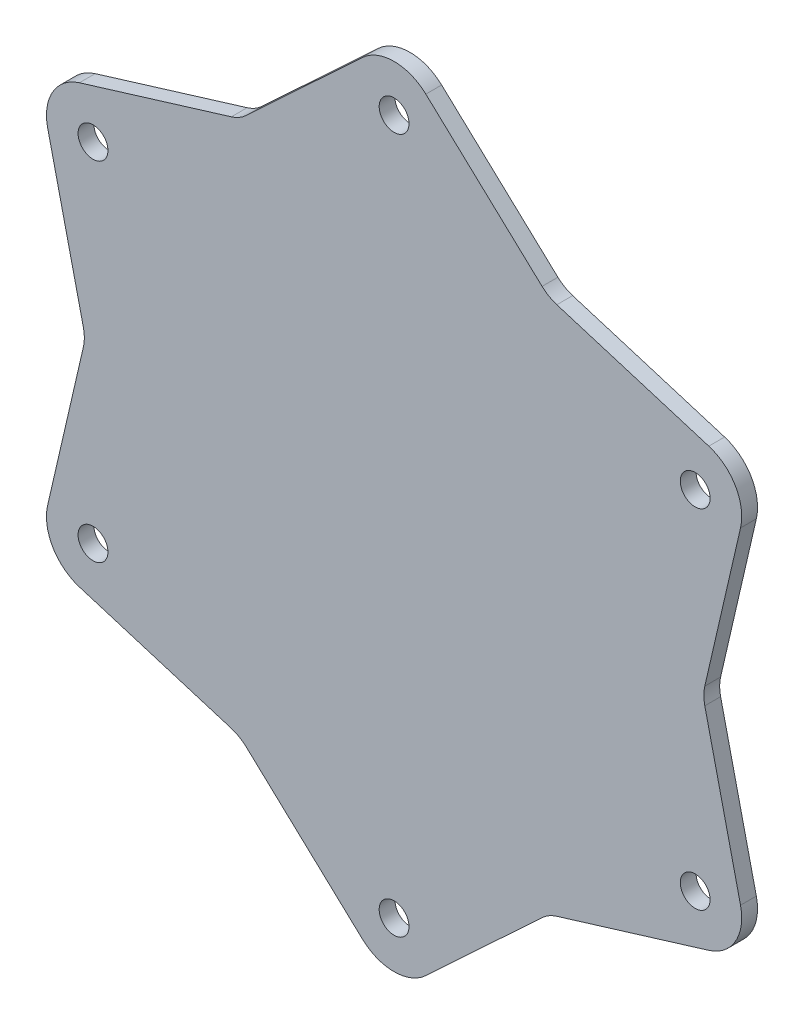
ISO-10303-21;
HEADER;
FILE_DESCRIPTION(('STEP AP214'),'2;1');
FILE_NAME('part.step','',(''),(''),'','','');
FILE_SCHEMA(('AUTOMOTIVE_DESIGN { 1 0 10303 214 1 1 1 1 }'));
ENDSEC;
DATA;
#1=APPLICATION_CONTEXT('core data for automotive mechanical design processes');
#2=APPLICATION_PROTOCOL_DEFINITION('international standard','automotive_design',2000,#1);
#3=PRODUCT_CONTEXT('',#1,'mechanical');
#4=PRODUCT('Part','Part','',(#3));
#5=PRODUCT_RELATED_PRODUCT_CATEGORY('part','',(#4));
#6=PRODUCT_DEFINITION_FORMATION('','',#4);
#7=PRODUCT_DEFINITION_CONTEXT('part definition',#1,'design');
#8=PRODUCT_DEFINITION('design','',#6,#7);
#9=PRODUCT_DEFINITION_SHAPE('','',#8);
#10=(LENGTH_UNIT() NAMED_UNIT(*) SI_UNIT(.MILLI.,.METRE.));
#11=(NAMED_UNIT(*) PLANE_ANGLE_UNIT() SI_UNIT($,.RADIAN.));
#12=(NAMED_UNIT(*) SI_UNIT($,.STERADIAN.) SOLID_ANGLE_UNIT());
#13=UNCERTAINTY_MEASURE_WITH_UNIT(LENGTH_MEASURE(1.E-05),#10,'distance_accuracy_value','');
#14=(GEOMETRIC_REPRESENTATION_CONTEXT(3) GLOBAL_UNCERTAINTY_ASSIGNED_CONTEXT((#13)) GLOBAL_UNIT_ASSIGNED_CONTEXT((#10,
#11,#12)) REPRESENTATION_CONTEXT('',''));
#15=CARTESIAN_POINT('',(0.,0.,0.));
#16=DIRECTION('',(0.,0.,1.));
#17=DIRECTION('',(1.,0.,0.));
#18=AXIS2_PLACEMENT_3D('',#15,#16,#17);
#19=CARTESIAN_POINT('',(0.,69.85,3.175));
#20=DIRECTION('',(0.,0.,1.));
#21=DIRECTION('',(1.,0.,0.));
#22=AXIS2_PLACEMENT_3D('',#19,#20,#21);
#23=PLANE('',#22);
#24=CARTESIAN_POINT('',(-60.4918744543433,-34.9249999999994,3.175));
#25=DIRECTION('',(0.,0.,1.));
#26=DIRECTION('',(1.,0.,0.));
#27=AXIS2_PLACEMENT_3D('',#24,#25,#26);
#28=CIRCLE('',#27,3.);
#29=CARTESIAN_POINT('',(-57.4918744543433,-34.9249999999994,3.175));
#30=VERTEX_POINT('',#29);
#31=EDGE_CURVE('E538',#30,#30,#28,.T.);
#32=ORIENTED_EDGE('',*,*,#31,.F.);
#33=EDGE_LOOP('',(#32));
#34=FACE_BOUND('',#33,.T.);
#35=CARTESIAN_POINT('',(60.4918744543429,-34.9250000000003,3.175));
#36=DIRECTION('',(0.,0.,1.));
#37=DIRECTION('',(1.,0.,0.));
#38=AXIS2_PLACEMENT_3D('',#35,#36,#37);
#39=CIRCLE('',#38,3.00000000000001);
#40=CARTESIAN_POINT('',(63.4918744543429,-34.9250000000003,3.175));
#41=VERTEX_POINT('',#40);
#42=EDGE_CURVE('E554',#41,#41,#39,.T.);
#43=ORIENTED_EDGE('',*,*,#42,.F.);
#44=EDGE_LOOP('',(#43));
#45=FACE_BOUND('',#44,.T.);
#46=CARTESIAN_POINT('',(0.,69.85,3.175));
#47=DIRECTION('',(0.,0.,1.));
#48=DIRECTION('',(1.,0.,0.));
#49=AXIS2_PLACEMENT_3D('',#46,#47,#48);
#50=CIRCLE('',#49,3.);
#51=CARTESIAN_POINT('',(3.,69.85,3.175));
#52=VERTEX_POINT('',#51);
#53=EDGE_CURVE('E248',#52,#52,#50,.T.);
#54=ORIENTED_EDGE('',*,*,#53,.F.);
#55=EDGE_LOOP('',(#54));
#56=FACE_BOUND('',#55,.T.);
#57=CARTESIAN_POINT('',(0.,69.85,3.175));
#58=DIRECTION('',(0.,0.,1.));
#59=DIRECTION('',(1.,0.,0.));
#60=AXIS2_PLACEMENT_3D('',#57,#58,#59);
#61=CIRCLE('',#60,9.35);
#62=CARTESIAN_POINT('',(6.37567942182381,76.6890943779226,3.175));
#63=VERTEX_POINT('',#62);
#64=CARTESIAN_POINT('',(-6.37567942182381,76.6890943779226,3.175));
#65=VERTEX_POINT('',#64);
#66=EDGE_CURVE('E314',#63,#65,#61,.T.);
#67=ORIENTED_EDGE('',*,*,#66,.T.);
#68=DIRECTION('',(-0.731453944162845,-0.681890847253883,0.));
#69=VECTOR('',#68,1.);
#70=CARTESIAN_POINT('',(-6.37567942182381,76.6890943779226,3.175));
#71=LINE('',#70,#69);
#72=CARTESIAN_POINT('',(-29.7289917439253,54.918195399822,3.175));
#73=VERTEX_POINT('',#72);
#74=EDGE_CURVE('E154',#65,#73,#71,.T.);
#75=ORIENTED_EDGE('',*,*,#74,.T.);
#76=CARTESIAN_POINT('',(-34.9249999999992,60.4918744543435,3.175));
#77=DIRECTION('',(0.,0.,-1.));
#78=DIRECTION('',(1.,0.,0.));
#79=AXIS2_PLACEMENT_3D('',#76,#77,#78);
#80=CIRCLE('',#79,7.62);
#81=CARTESIAN_POINT('',(-32.6960564742811,53.2051597790483,3.175));
#82=VERTEX_POINT('',#81);
#83=EDGE_CURVE('E399',#73,#82,#80,.T.);
#84=ORIENTED_EDGE('',*,*,#83,.T.);
#85=DIRECTION('',(-0.956261768411379,-0.292512273716407,0.));
#86=VECTOR('',#85,1.);
#87=CARTESIAN_POINT('',(-63.2268642135916,43.8660475346463,3.175));
#88=LINE('',#87,#86);
#89=CARTESIAN_POINT('',(-63.2268642135918,43.8660475346469,3.175));
#90=VERTEX_POINT('',#89);
#91=EDGE_CURVE('E419',#82,#90,#88,.T.);
#92=ORIENTED_EDGE('',*,*,#91,.T.);
#93=CARTESIAN_POINT('',(-60.4918744543426,34.9250000000007,3.175));
#94=DIRECTION('',(0.,0.,1.));
#95=DIRECTION('',(1.,0.,0.));
#96=AXIS2_PLACEMENT_3D('',#93,#94,#95);
#97=CIRCLE('',#96,9.35000000000005);
#98=CARTESIAN_POINT('',(-69.6025436354154,32.8230468432761,3.175));
#99=VERTEX_POINT('',#98);
#100=EDGE_CURVE('E415',#90,#99,#97,.T.);
#101=ORIENTED_EDGE('',*,*,#100,.T.);
#102=DIRECTION('',(0.224807824248535,-0.974403120970289,0.));
#103=VECTOR('',#102,1.);
#104=CARTESIAN_POINT('',(-69.6025436354154,32.8230468432761,3.175));
#105=LINE('',#104,#103);
#106=CARTESIAN_POINT('',(-62.4250482182063,1.71303562077369,3.175));
#107=VERTEX_POINT('',#106);
#108=EDGE_CURVE('E418',#99,#107,#105,.T.);
#109=ORIENTED_EDGE('',*,*,#108,.T.);
#110=CARTESIAN_POINT('',(-69.85,7.32053306862213E-13,3.175));
#111=DIRECTION('',(0.,0.,-1.));
#112=DIRECTION('',(1.,0.,0.));
#113=AXIS2_PLACEMENT_3D('',#110,#111,#112);
#114=CIRCLE('',#113,7.61999999999985);
#115=CARTESIAN_POINT('',(-62.4250482182065,-1.71303562077395,3.175));
#116=VERTEX_POINT('',#115);
#117=EDGE_CURVE('E423',#107,#116,#114,.T.);
#118=ORIENTED_EDGE('',*,*,#117,.T.);
#119=DIRECTION('',(-0.224807824248533,-0.97440312097029,0.));
#120=VECTOR('',#119,1.);
#121=CARTESIAN_POINT('',(-69.6025436354153,-32.8230468432764,3.175));
#122=LINE('',#121,#120);
#123=CARTESIAN_POINT('',(-69.6025436354158,-32.8230468432763,3.175));
#124=VERTEX_POINT('',#123);
#125=EDGE_CURVE('E430',#116,#124,#122,.T.);
#126=ORIENTED_EDGE('',*,*,#125,.T.);
#127=CARTESIAN_POINT('',(-60.4918744543433,-34.9249999999994,3.175));
#128=DIRECTION('',(0.,0.,1.));
#129=DIRECTION('',(1.,0.,0.));
#130=AXIS2_PLACEMENT_3D('',#127,#128,#129);
#131=CIRCLE('',#130,9.35000000000015);
#132=CARTESIAN_POINT('',(-63.2268642135915,-43.8660475346466,3.175));
#133=VERTEX_POINT('',#132);
#134=EDGE_CURVE('E433',#124,#133,#131,.T.);
#135=ORIENTED_EDGE('',*,*,#134,.T.);
#136=DIRECTION('',(0.956261768411379,-0.292512273716406,0.));
#137=VECTOR('',#136,1.);
#138=CARTESIAN_POINT('',(-63.2268642135915,-43.8660475346466,3.175));
#139=LINE('',#138,#137);
#140=CARTESIAN_POINT('',(-32.696056474281,-53.2051597790484,3.175));
#141=VERTEX_POINT('',#140);
#142=EDGE_CURVE('E436',#133,#141,#139,.T.);
#143=ORIENTED_EDGE('',*,*,#142,.T.);
#144=CARTESIAN_POINT('',(-34.9250000000005,-60.4918744543427,3.175));
#145=DIRECTION('',(0.,0.,-1.));
#146=DIRECTION('',(1.,0.,0.));
#147=AXIS2_PLACEMENT_3D('',#144,#145,#146);
#148=CIRCLE('',#147,7.61999999999978);
#149=CARTESIAN_POINT('',(-29.7289917439255,-54.9181953998224,3.175));
#150=VERTEX_POINT('',#149);
#151=EDGE_CURVE('E439',#141,#150,#148,.T.);
#152=ORIENTED_EDGE('',*,*,#151,.T.);
#153=DIRECTION('',(0.731453944162845,-0.681890847253882,0.));
#154=VECTOR('',#153,1.);
#155=CARTESIAN_POINT('',(-6.37567942182381,-76.6890943779228,3.175));
#156=LINE('',#155,#154);
#157=CARTESIAN_POINT('',(-6.37567942182404,-76.6890943779231,3.175));
#158=VERTEX_POINT('',#157);
#159=EDGE_CURVE('E442',#150,#158,#156,.T.);
#160=ORIENTED_EDGE('',*,*,#159,.T.);
#161=CARTESIAN_POINT('',(-4.94698836940293E-13,-69.85,3.175));
#162=DIRECTION('',(0.,0.,1.));
#163=DIRECTION('',(1.,0.,0.));
#164=AXIS2_PLACEMENT_3D('',#161,#162,#163);
#165=CIRCLE('',#164,9.35000000000018);
#166=CARTESIAN_POINT('',(6.3756794218238,-76.6890943779228,3.175));
#167=VERTEX_POINT('',#166);
#168=EDGE_CURVE('E445',#158,#167,#165,.T.);
#169=ORIENTED_EDGE('',*,*,#168,.T.);
#170=DIRECTION('',(0.731453944162845,0.681890847253883,0.));
#171=VECTOR('',#170,1.);
#172=CARTESIAN_POINT('',(6.3756794218238,-76.6890943779228,3.175));
#173=LINE('',#172,#171);
#174=CARTESIAN_POINT('',(29.7289917439254,-54.9181953998223,3.175));
#175=VERTEX_POINT('',#174);
#176=EDGE_CURVE('E448',#167,#175,#173,.T.);
#177=ORIENTED_EDGE('',*,*,#176,.T.);
#178=CARTESIAN_POINT('',(34.9249999999996,-60.4918744543433,3.175));
#179=DIRECTION('',(0.,0.,-1.));
#180=DIRECTION('',(1.,0.,0.));
#181=AXIS2_PLACEMENT_3D('',#178,#179,#180);
#182=CIRCLE('',#181,7.61999999999982);
#183=CARTESIAN_POINT('',(32.696056474281,-53.2051597790486,3.175));
#184=VERTEX_POINT('',#183);
#185=EDGE_CURVE('E451',#175,#184,#182,.T.);
#186=ORIENTED_EDGE('',*,*,#185,.T.);
#187=DIRECTION('',(0.956261768411379,0.292512273716407,0.));
#188=VECTOR('',#187,1.);
#189=CARTESIAN_POINT('',(63.2268642135915,-43.8660475346466,3.175));
#190=LINE('',#189,#188);
#191=CARTESIAN_POINT('',(63.2268642135916,-43.8660475346467,3.175));
#192=VERTEX_POINT('',#191);
#193=EDGE_CURVE('E454',#184,#192,#190,.T.);
#194=ORIENTED_EDGE('',*,*,#193,.T.);
#195=CARTESIAN_POINT('',(60.4918744543429,-34.9250000000003,3.175));
#196=DIRECTION('',(0.,0.,1.));
#197=DIRECTION('',(1.,0.,0.));
#198=AXIS2_PLACEMENT_3D('',#195,#196,#197);
#199=CIRCLE('',#198,9.35000000000012);
#200=CARTESIAN_POINT('',(69.6025436354153,-32.8230468432764,3.175));
#201=VERTEX_POINT('',#200);
#202=EDGE_CURVE('E457',#192,#201,#199,.T.);
#203=ORIENTED_EDGE('',*,*,#202,.T.);
#204=DIRECTION('',(-0.224807824248534,0.974403120970289,0.));
#205=VECTOR('',#204,1.);
#206=CARTESIAN_POINT('',(69.6025436354153,-32.8230468432764,3.175));
#207=LINE('',#206,#205);
#208=CARTESIAN_POINT('',(62.4250482182065,-1.71303562077391,3.175));
#209=VERTEX_POINT('',#208);
#210=EDGE_CURVE('E460',#201,#209,#207,.T.);
#211=ORIENTED_EDGE('',*,*,#210,.T.);
#212=CARTESIAN_POINT('',(69.85,-2.39391839684799E-13,3.175));
#213=DIRECTION('',(0.,0.,-1.));
#214=DIRECTION('',(1.,0.,0.));
#215=AXIS2_PLACEMENT_3D('',#212,#213,#214);
#216=CIRCLE('',#215,7.6199999999999);
#217=CARTESIAN_POINT('',(62.4250482182065,1.71303562077369,3.175));
#218=VERTEX_POINT('',#217);
#219=EDGE_CURVE('E463',#209,#218,#216,.T.);
#220=ORIENTED_EDGE('',*,*,#219,.T.);
#221=DIRECTION('',(0.224807824248534,0.974403120970289,0.));
#222=VECTOR('',#221,1.);
#223=CARTESIAN_POINT('',(69.6025436354153,32.8230468432761,3.175));
#224=LINE('',#223,#222);
#225=CARTESIAN_POINT('',(69.6025436354154,32.8230468432761,3.175));
#226=VERTEX_POINT('',#225);
#227=EDGE_CURVE('E466',#218,#226,#224,.T.);
#228=ORIENTED_EDGE('',*,*,#227,.T.);
#229=CARTESIAN_POINT('',(60.4918744543431,34.9249999999999,3.175));
#230=DIRECTION('',(0.,0.,1.));
#231=DIRECTION('',(1.,0.,0.));
#232=AXIS2_PLACEMENT_3D('',#229,#230,#231);
#233=CIRCLE('',#232,9.35000000000004);
#234=CARTESIAN_POINT('',(63.2268642135915,43.8660475346463,3.175));
#235=VERTEX_POINT('',#234);
#236=EDGE_CURVE('E221',#226,#235,#233,.T.);
#237=ORIENTED_EDGE('',*,*,#236,.T.);
#238=DIRECTION('',(-0.956261768411379,0.292512273716406,0.));
#239=VECTOR('',#238,1.);
#240=CARTESIAN_POINT('',(63.2268642135915,43.8660475346463,3.175));
#241=LINE('',#240,#239);
#242=CARTESIAN_POINT('',(32.696056474281,53.2051597790483,3.175));
#243=VERTEX_POINT('',#242);
#244=EDGE_CURVE('E215',#235,#243,#241,.T.);
#245=ORIENTED_EDGE('',*,*,#244,.T.);
#246=CARTESIAN_POINT('',(34.9250000000001,60.491874454343,3.175));
#247=DIRECTION('',(0.,0.,-1.));
#248=DIRECTION('',(1.,0.,0.));
#249=AXIS2_PLACEMENT_3D('',#246,#247,#248);
#250=CIRCLE('',#249,7.62);
#251=CARTESIAN_POINT('',(29.7289917439255,54.9181953998221,3.175));
#252=VERTEX_POINT('',#251);
#253=EDGE_CURVE('E219',#243,#252,#250,.T.);
#254=ORIENTED_EDGE('',*,*,#253,.T.);
#255=DIRECTION('',(-0.731453944162845,0.681890847253883,0.));
#256=VECTOR('',#255,1.);
#257=CARTESIAN_POINT('',(6.37567942182381,76.6890943779226,3.175));
#258=LINE('',#257,#256);
#259=EDGE_CURVE('E63',#252,#63,#258,.T.);
#260=ORIENTED_EDGE('',*,*,#259,.T.);
#261=EDGE_LOOP('',(#67,#75,#84,#92,#101,#109,#118,#126,#135,#143,#152,#160,#169,#177,#186,#194,
#203,#211,#220,#228,#237,#245,#254,#260));
#262=FACE_BOUND('',#261,.T.);
#263=CARTESIAN_POINT('',(60.4918744543431,34.9249999999999,3.175));
#264=DIRECTION('',(0.,0.,1.));
#265=DIRECTION('',(1.,0.,0.));
#266=AXIS2_PLACEMENT_3D('',#263,#264,#265);
#267=CIRCLE('',#266,3.);
#268=CARTESIAN_POINT('',(63.4918744543431,34.9249999999999,3.175));
#269=VERTEX_POINT('',#268);
#270=EDGE_CURVE('E562',#269,#269,#267,.T.);
#271=ORIENTED_EDGE('',*,*,#270,.F.);
#272=EDGE_LOOP('',(#271));
#273=FACE_BOUND('',#272,.T.);
#274=CARTESIAN_POINT('',(-4.94698836940293E-13,-69.85,3.175));
#275=DIRECTION('',(0.,0.,1.));
#276=DIRECTION('',(1.,0.,0.));
#277=AXIS2_PLACEMENT_3D('',#274,#275,#276);
#278=CIRCLE('',#277,3.);
#279=CARTESIAN_POINT('',(2.99999999999951,-69.85,3.175));
#280=VERTEX_POINT('',#279);
#281=EDGE_CURVE('E546',#280,#280,#278,.T.);
#282=ORIENTED_EDGE('',*,*,#281,.F.);
#283=EDGE_LOOP('',(#282));
#284=FACE_BOUND('',#283,.T.);
#285=CARTESIAN_POINT('',(-60.4918744543426,34.9250000000007,3.175));
#286=DIRECTION('',(0.,0.,1.));
#287=DIRECTION('',(1.,0.,0.));
#288=AXIS2_PLACEMENT_3D('',#285,#286,#287);
#289=CIRCLE('',#288,3.);
#290=CARTESIAN_POINT('',(-57.4918744543426,34.9250000000007,3.175));
#291=VERTEX_POINT('',#290);
#292=EDGE_CURVE('E527',#291,#291,#289,.T.);
#293=ORIENTED_EDGE('',*,*,#292,.F.);
#294=EDGE_LOOP('',(#293));
#295=FACE_BOUND('',#294,.T.);
#296=ADVANCED_FACE('F45',(#34,#45,#56,#262,#273,#284,#295),#23,.T.);
#297=CARTESIAN_POINT('',(0.,69.85,0.));
#298=DIRECTION('',(0.,0.,1.));
#299=DIRECTION('',(1.,0.,0.));
#300=AXIS2_PLACEMENT_3D('',#297,#298,#299);
#301=PLANE('',#300);
#302=CARTESIAN_POINT('',(0.,69.85,0.));
#303=DIRECTION('',(0.,0.,1.));
#304=DIRECTION('',(1.,0.,0.));
#305=AXIS2_PLACEMENT_3D('',#302,#303,#304);
#306=CIRCLE('',#305,9.35);
#307=CARTESIAN_POINT('',(6.37567942182381,76.6890943779226,0.));
#308=VERTEX_POINT('',#307);
#309=CARTESIAN_POINT('',(-6.37567942182381,76.6890943779226,0.));
#310=VERTEX_POINT('',#309);
#311=EDGE_CURVE('E243',#308,#310,#306,.T.);
#312=ORIENTED_EDGE('',*,*,#311,.F.);
#313=DIRECTION('',(-0.731453944162845,0.681890847253883,0.));
#314=VECTOR('',#313,1.);
#315=CARTESIAN_POINT('',(6.37567942182381,76.6890943779226,0.));
#316=LINE('',#315,#314);
#317=CARTESIAN_POINT('',(29.7289917439255,54.9181953998221,0.));
#318=VERTEX_POINT('',#317);
#319=EDGE_CURVE('E146',#318,#308,#316,.T.);
#320=ORIENTED_EDGE('',*,*,#319,.F.);
#321=CARTESIAN_POINT('',(34.9250000000001,60.491874454343,0.));
#322=DIRECTION('',(0.,0.,-1.));
#323=DIRECTION('',(1.,0.,0.));
#324=AXIS2_PLACEMENT_3D('',#321,#322,#323);
#325=CIRCLE('',#324,7.62);
#326=CARTESIAN_POINT('',(32.696056474281,53.2051597790483,0.));
#327=VERTEX_POINT('',#326);
#328=EDGE_CURVE('E140',#327,#318,#325,.T.);
#329=ORIENTED_EDGE('',*,*,#328,.F.);
#330=DIRECTION('',(-0.956261768411379,0.292512273716406,0.));
#331=VECTOR('',#330,1.);
#332=CARTESIAN_POINT('',(63.2268642135915,43.8660475346463,0.));
#333=LINE('',#332,#331);
#334=CARTESIAN_POINT('',(63.2268642135915,43.8660475346463,0.));
#335=VERTEX_POINT('',#334);
#336=EDGE_CURVE('E230',#335,#327,#333,.T.);
#337=ORIENTED_EDGE('',*,*,#336,.F.);
#338=CARTESIAN_POINT('',(60.4918744543431,34.9249999999999,0.));
#339=DIRECTION('',(0.,0.,1.));
#340=DIRECTION('',(1.,0.,0.));
#341=AXIS2_PLACEMENT_3D('',#338,#339,#340);
#342=CIRCLE('',#341,9.35000000000004);
#343=CARTESIAN_POINT('',(69.6025436354154,32.8230468432761,0.));
#344=VERTEX_POINT('',#343);
#345=EDGE_CURVE('E305',#344,#335,#342,.T.);
#346=ORIENTED_EDGE('',*,*,#345,.F.);
#347=DIRECTION('',(0.224807824248534,0.974403120970289,0.));
#348=VECTOR('',#347,1.);
#349=CARTESIAN_POINT('',(69.6025436354153,32.8230468432761,0.));
#350=LINE('',#349,#348);
#351=CARTESIAN_POINT('',(62.4250482182065,1.71303562077369,0.));
#352=VERTEX_POINT('',#351);
#353=EDGE_CURVE('E302',#352,#344,#350,.T.);
#354=ORIENTED_EDGE('',*,*,#353,.F.);
#355=CARTESIAN_POINT('',(69.85,-2.39391839684799E-13,0.));
#356=DIRECTION('',(0.,0.,-1.));
#357=DIRECTION('',(1.,0.,0.));
#358=AXIS2_PLACEMENT_3D('',#355,#356,#357);
#359=CIRCLE('',#358,7.6199999999999);
#360=CARTESIAN_POINT('',(62.4250482182065,-1.71303562077391,0.));
#361=VERTEX_POINT('',#360);
#362=EDGE_CURVE('E299',#361,#352,#359,.T.);
#363=ORIENTED_EDGE('',*,*,#362,.F.);
#364=DIRECTION('',(-0.224807824248534,0.974403120970289,0.));
#365=VECTOR('',#364,1.);
#366=CARTESIAN_POINT('',(69.6025436354153,-32.8230468432764,0.));
#367=LINE('',#366,#365);
#368=CARTESIAN_POINT('',(69.6025436354153,-32.8230468432764,0.));
#369=VERTEX_POINT('',#368);
#370=EDGE_CURVE('E296',#369,#361,#367,.T.);
#371=ORIENTED_EDGE('',*,*,#370,.F.);
#372=CARTESIAN_POINT('',(60.4918744543429,-34.9250000000003,0.));
#373=DIRECTION('',(0.,0.,1.));
#374=DIRECTION('',(1.,0.,0.));
#375=AXIS2_PLACEMENT_3D('',#372,#373,#374);
#376=CIRCLE('',#375,9.35000000000012);
#377=CARTESIAN_POINT('',(63.2268642135916,-43.8660475346467,0.));
#378=VERTEX_POINT('',#377);
#379=EDGE_CURVE('E293',#378,#369,#376,.T.);
#380=ORIENTED_EDGE('',*,*,#379,.F.);
#381=DIRECTION('',(0.956261768411379,0.292512273716407,0.));
#382=VECTOR('',#381,1.);
#383=CARTESIAN_POINT('',(63.2268642135915,-43.8660475346466,0.));
#384=LINE('',#383,#382);
#385=CARTESIAN_POINT('',(32.696056474281,-53.2051597790486,0.));
#386=VERTEX_POINT('',#385);
#387=EDGE_CURVE('E290',#386,#378,#384,.T.);
#388=ORIENTED_EDGE('',*,*,#387,.F.);
#389=CARTESIAN_POINT('',(34.9249999999996,-60.4918744543433,0.));
#390=DIRECTION('',(0.,0.,-1.));
#391=DIRECTION('',(1.,0.,0.));
#392=AXIS2_PLACEMENT_3D('',#389,#390,#391);
#393=CIRCLE('',#392,7.61999999999982);
#394=CARTESIAN_POINT('',(29.7289917439254,-54.9181953998223,0.));
#395=VERTEX_POINT('',#394);
#396=EDGE_CURVE('E287',#395,#386,#393,.T.);
#397=ORIENTED_EDGE('',*,*,#396,.F.);
#398=DIRECTION('',(0.731453944162845,0.681890847253883,0.));
#399=VECTOR('',#398,1.);
#400=CARTESIAN_POINT('',(6.3756794218238,-76.6890943779228,0.));
#401=LINE('',#400,#399);
#402=CARTESIAN_POINT('',(6.3756794218238,-76.6890943779228,0.));
#403=VERTEX_POINT('',#402);
#404=EDGE_CURVE('E284',#403,#395,#401,.T.);
#405=ORIENTED_EDGE('',*,*,#404,.F.);
#406=CARTESIAN_POINT('',(-4.94698836940293E-13,-69.85,0.));
#407=DIRECTION('',(0.,0.,1.));
#408=DIRECTION('',(1.,0.,0.));
#409=AXIS2_PLACEMENT_3D('',#406,#407,#408);
#410=CIRCLE('',#409,9.35000000000018);
#411=CARTESIAN_POINT('',(-6.37567942182404,-76.6890943779231,0.));
#412=VERTEX_POINT('',#411);
#413=EDGE_CURVE('E281',#412,#403,#410,.T.);
#414=ORIENTED_EDGE('',*,*,#413,.F.);
#415=DIRECTION('',(0.731453944162845,-0.681890847253882,0.));
#416=VECTOR('',#415,1.);
#417=CARTESIAN_POINT('',(-6.37567942182381,-76.6890943779228,0.));
#418=LINE('',#417,#416);
#419=CARTESIAN_POINT('',(-29.7289917439255,-54.9181953998224,0.));
#420=VERTEX_POINT('',#419);
#421=EDGE_CURVE('E278',#420,#412,#418,.T.);
#422=ORIENTED_EDGE('',*,*,#421,.F.);
#423=CARTESIAN_POINT('',(-34.9250000000005,-60.4918744543427,0.));
#424=DIRECTION('',(0.,0.,-1.));
#425=DIRECTION('',(1.,0.,0.));
#426=AXIS2_PLACEMENT_3D('',#423,#424,#425);
#427=CIRCLE('',#426,7.61999999999978);
#428=CARTESIAN_POINT('',(-32.696056474281,-53.2051597790484,0.));
#429=VERTEX_POINT('',#428);
#430=EDGE_CURVE('E275',#429,#420,#427,.T.);
#431=ORIENTED_EDGE('',*,*,#430,.F.);
#432=DIRECTION('',(0.956261768411379,-0.292512273716406,0.));
#433=VECTOR('',#432,1.);
#434=CARTESIAN_POINT('',(-63.2268642135915,-43.8660475346466,0.));
#435=LINE('',#434,#433);
#436=CARTESIAN_POINT('',(-63.2268642135915,-43.8660475346466,0.));
#437=VERTEX_POINT('',#436);
#438=EDGE_CURVE('E272',#437,#429,#435,.T.);
#439=ORIENTED_EDGE('',*,*,#438,.F.);
#440=CARTESIAN_POINT('',(-60.4918744543433,-34.9249999999994,0.));
#441=DIRECTION('',(0.,0.,1.));
#442=DIRECTION('',(1.,0.,0.));
#443=AXIS2_PLACEMENT_3D('',#440,#441,#442);
#444=CIRCLE('',#443,9.35000000000015);
#445=CARTESIAN_POINT('',(-69.6025436354158,-32.8230468432763,0.));
#446=VERTEX_POINT('',#445);
#447=EDGE_CURVE('E269',#446,#437,#444,.T.);
#448=ORIENTED_EDGE('',*,*,#447,.F.);
#449=DIRECTION('',(-0.224807824248533,-0.97440312097029,0.));
#450=VECTOR('',#449,1.);
#451=CARTESIAN_POINT('',(-69.6025436354153,-32.8230468432764,0.));
#452=LINE('',#451,#450);
#453=CARTESIAN_POINT('',(-62.4250482182065,-1.71303562077395,0.));
#454=VERTEX_POINT('',#453);
#455=EDGE_CURVE('E266',#454,#446,#452,.T.);
#456=ORIENTED_EDGE('',*,*,#455,.F.);
#457=CARTESIAN_POINT('',(-69.85,7.32053306862213E-13,0.));
#458=DIRECTION('',(0.,0.,-1.));
#459=DIRECTION('',(1.,0.,0.));
#460=AXIS2_PLACEMENT_3D('',#457,#458,#459);
#461=CIRCLE('',#460,7.61999999999985);
#462=CARTESIAN_POINT('',(-62.4250482182063,1.71303562077369,0.));
#463=VERTEX_POINT('',#462);
#464=EDGE_CURVE('E263',#463,#454,#461,.T.);
#465=ORIENTED_EDGE('',*,*,#464,.F.);
#466=DIRECTION('',(0.224807824248535,-0.974403120970289,0.));
#467=VECTOR('',#466,1.);
#468=CARTESIAN_POINT('',(-69.6025436354154,32.8230468432761,0.));
#469=LINE('',#468,#467);
#470=CARTESIAN_POINT('',(-69.6025436354154,32.8230468432761,0.));
#471=VERTEX_POINT('',#470);
#472=EDGE_CURVE('E260',#471,#463,#469,.T.);
#473=ORIENTED_EDGE('',*,*,#472,.F.);
#474=CARTESIAN_POINT('',(-60.4918744543426,34.9250000000007,0.));
#475=DIRECTION('',(0.,0.,1.));
#476=DIRECTION('',(1.,0.,0.));
#477=AXIS2_PLACEMENT_3D('',#474,#475,#476);
#478=CIRCLE('',#477,9.35000000000005);
#479=CARTESIAN_POINT('',(-63.2268642135918,43.8660475346469,0.));
#480=VERTEX_POINT('',#479);
#481=EDGE_CURVE('E257',#480,#471,#478,.T.);
#482=ORIENTED_EDGE('',*,*,#481,.F.);
#483=DIRECTION('',(-0.956261768411379,-0.292512273716407,0.));
#484=VECTOR('',#483,1.);
#485=CARTESIAN_POINT('',(-63.2268642135916,43.8660475346463,0.));
#486=LINE('',#485,#484);
#487=CARTESIAN_POINT('',(-32.6960564742811,53.2051597790483,0.));
#488=VERTEX_POINT('',#487);
#489=EDGE_CURVE('E254',#488,#480,#486,.T.);
#490=ORIENTED_EDGE('',*,*,#489,.F.);
#491=CARTESIAN_POINT('',(-34.9249999999992,60.4918744543435,0.));
#492=DIRECTION('',(0.,0.,-1.));
#493=DIRECTION('',(1.,0.,0.));
#494=AXIS2_PLACEMENT_3D('',#491,#492,#493);
#495=CIRCLE('',#494,7.62);
#496=CARTESIAN_POINT('',(-29.7289917439253,54.918195399822,0.));
#497=VERTEX_POINT('',#496);
#498=EDGE_CURVE('E251',#497,#488,#495,.T.);
#499=ORIENTED_EDGE('',*,*,#498,.F.);
#500=DIRECTION('',(-0.731453944162845,-0.681890847253883,0.));
#501=VECTOR('',#500,1.);
#502=CARTESIAN_POINT('',(-6.37567942182381,76.6890943779226,0.));
#503=LINE('',#502,#501);
#504=EDGE_CURVE('E247',#310,#497,#503,.T.);
#505=ORIENTED_EDGE('',*,*,#504,.F.);
#506=EDGE_LOOP('',(#312,#320,#329,#337,#346,#354,#363,#371,#380,#388,#397,#405,#414,#422,#431,
#439,#448,#456,#465,#473,#482,#490,#499,#505));
#507=FACE_BOUND('',#506,.T.);
#508=CARTESIAN_POINT('',(0.,69.85,0.));
#509=DIRECTION('',(0.,0.,1.));
#510=DIRECTION('',(1.,0.,0.));
#511=AXIS2_PLACEMENT_3D('',#508,#509,#510);
#512=CIRCLE('',#511,3.);
#513=CARTESIAN_POINT('',(3.,69.85,0.));
#514=VERTEX_POINT('',#513);
#515=EDGE_CURVE('E566',#514,#514,#512,.T.);
#516=ORIENTED_EDGE('',*,*,#515,.T.);
#517=EDGE_LOOP('',(#516));
#518=FACE_BOUND('',#517,.T.);
#519=CARTESIAN_POINT('',(60.4918744543431,34.9249999999999,0.));
#520=DIRECTION('',(0.,0.,1.));
#521=DIRECTION('',(1.,0.,0.));
#522=AXIS2_PLACEMENT_3D('',#519,#520,#521);
#523=CIRCLE('',#522,3.);
#524=CARTESIAN_POINT('',(63.4918744543431,34.9249999999999,0.));
#525=VERTEX_POINT('',#524);
#526=EDGE_CURVE('E558',#525,#525,#523,.T.);
#527=ORIENTED_EDGE('',*,*,#526,.T.);
#528=EDGE_LOOP('',(#527));
#529=FACE_BOUND('',#528,.T.);
#530=CARTESIAN_POINT('',(60.4918744543429,-34.9250000000003,0.));
#531=DIRECTION('',(0.,0.,1.));
#532=DIRECTION('',(1.,0.,0.));
#533=AXIS2_PLACEMENT_3D('',#530,#531,#532);
#534=CIRCLE('',#533,3.00000000000001);
#535=CARTESIAN_POINT('',(63.4918744543429,-34.9250000000003,0.));
#536=VERTEX_POINT('',#535);
#537=EDGE_CURVE('E550',#536,#536,#534,.T.);
#538=ORIENTED_EDGE('',*,*,#537,.T.);
#539=EDGE_LOOP('',(#538));
#540=FACE_BOUND('',#539,.T.);
#541=CARTESIAN_POINT('',(-4.94698836940293E-13,-69.85,0.));
#542=DIRECTION('',(0.,0.,1.));
#543=DIRECTION('',(1.,0.,0.));
#544=AXIS2_PLACEMENT_3D('',#541,#542,#543);
#545=CIRCLE('',#544,3.);
#546=CARTESIAN_POINT('',(2.99999999999951,-69.85,0.));
#547=VERTEX_POINT('',#546);
#548=EDGE_CURVE('E542',#547,#547,#545,.T.);
#549=ORIENTED_EDGE('',*,*,#548,.T.);
#550=EDGE_LOOP('',(#549));
#551=FACE_BOUND('',#550,.T.);
#552=CARTESIAN_POINT('',(-60.4918744543433,-34.9249999999994,0.));
#553=DIRECTION('',(0.,0.,1.));
#554=DIRECTION('',(1.,0.,0.));
#555=AXIS2_PLACEMENT_3D('',#552,#553,#554);
#556=CIRCLE('',#555,3.);
#557=CARTESIAN_POINT('',(-57.4918744543433,-34.9249999999994,0.));
#558=VERTEX_POINT('',#557);
#559=EDGE_CURVE('E535',#558,#558,#556,.T.);
#560=ORIENTED_EDGE('',*,*,#559,.T.);
#561=EDGE_LOOP('',(#560));
#562=FACE_BOUND('',#561,.T.);
#563=CARTESIAN_POINT('',(-60.4918744543426,34.9250000000007,0.));
#564=DIRECTION('',(0.,0.,1.));
#565=DIRECTION('',(1.,0.,0.));
#566=AXIS2_PLACEMENT_3D('',#563,#564,#565);
#567=CIRCLE('',#566,3.);
#568=CARTESIAN_POINT('',(-57.4918744543426,34.9250000000007,0.));
#569=VERTEX_POINT('',#568);
#570=EDGE_CURVE('E530',#569,#569,#567,.T.);
#571=ORIENTED_EDGE('',*,*,#570,.T.);
#572=EDGE_LOOP('',(#571));
#573=FACE_BOUND('',#572,.T.);
#574=ADVANCED_FACE('F403',(#507,#518,#529,#540,#551,#562,#573),#301,.F.);
#575=CARTESIAN_POINT('',(0.,69.85,3.175));
#576=DIRECTION('',(0.,0.,-1.));
#577=DIRECTION('',(-1.,0.,0.));
#578=AXIS2_PLACEMENT_3D('',#575,#576,#577);
#579=CYLINDRICAL_SURFACE('',#578,9.35);
#580=ORIENTED_EDGE('',*,*,#311,.T.);
#581=DIRECTION('',(0.,0.,-1.));
#582=VECTOR('',#581,1.);
#583=CARTESIAN_POINT('',(-6.37567942182381,76.6890943779226,3.175));
#584=LINE('',#583,#582);
#585=EDGE_CURVE('E11',#65,#310,#584,.T.);
#586=ORIENTED_EDGE('',*,*,#585,.F.);
#587=ORIENTED_EDGE('',*,*,#66,.F.);
#588=DIRECTION('',(0.,0.,-1.));
#589=VECTOR('',#588,1.);
#590=CARTESIAN_POINT('',(6.37567942182381,76.6890943779226,3.175));
#591=LINE('',#590,#589);
#592=EDGE_CURVE('E239',#63,#308,#591,.T.);
#593=ORIENTED_EDGE('',*,*,#592,.T.);
#594=EDGE_LOOP('',(#580,#586,#587,#593));
#595=FACE_BOUND('',#594,.T.);
#596=ADVANCED_FACE('F47',(#595),#579,.T.);
#597=CARTESIAN_POINT('',(-6.37567942182381,76.6890943779226,3.175));
#598=DIRECTION('',(0.681890847253882,-0.731453944162845,0.));
#599=DIRECTION('',(0.731453944162845,0.681890847253883,0.));
#600=AXIS2_PLACEMENT_3D('',#597,#598,#599);
#601=PLANE('',#600);
#602=ORIENTED_EDGE('',*,*,#504,.T.);
#603=DIRECTION('',(0.,0.,-1.));
#604=VECTOR('',#603,1.);
#605=CARTESIAN_POINT('',(-29.7289917439253,54.918195399822,3.175));
#606=LINE('',#605,#604);
#607=EDGE_CURVE('E55',#73,#497,#606,.T.);
#608=ORIENTED_EDGE('',*,*,#607,.F.);
#609=ORIENTED_EDGE('',*,*,#74,.F.);
#610=ORIENTED_EDGE('',*,*,#585,.T.);
#611=EDGE_LOOP('',(#602,#608,#609,#610));
#612=FACE_BOUND('',#611,.T.);
#613=ADVANCED_FACE('F826',(#612),#601,.F.);
#614=CARTESIAN_POINT('',(-34.9249999999992,60.4918744543435,3.175));
#615=DIRECTION('',(0.,0.,-1.));
#616=DIRECTION('',(-1.,0.,0.));
#617=AXIS2_PLACEMENT_3D('',#614,#615,#616);
#618=CYLINDRICAL_SURFACE('',#617,7.62);
#619=ORIENTED_EDGE('',*,*,#498,.T.);
#620=DIRECTION('',(0.,0.,-1.));
#621=VECTOR('',#620,1.);
#622=CARTESIAN_POINT('',(-32.6960564742811,53.2051597790483,3.175));
#623=LINE('',#622,#621);
#624=EDGE_CURVE('E389',#82,#488,#623,.T.);
#625=ORIENTED_EDGE('',*,*,#624,.F.);
#626=ORIENTED_EDGE('',*,*,#83,.F.);
#627=ORIENTED_EDGE('',*,*,#607,.T.);
#628=EDGE_LOOP('',(#619,#625,#626,#627));
#629=FACE_BOUND('',#628,.T.);
#630=ADVANCED_FACE('F397',(#629),#618,.F.);
#631=CARTESIAN_POINT('',(-63.2268642135916,43.8660475346463,3.175));
#632=DIRECTION('',(0.292512273716407,-0.956261768411379,0.));
#633=DIRECTION('',(0.956261768411379,0.292512273716407,0.));
#634=AXIS2_PLACEMENT_3D('',#631,#632,#633);
#635=PLANE('',#634);
#636=ORIENTED_EDGE('',*,*,#489,.T.);
#637=DIRECTION('',(0.,0.,-1.));
#638=VECTOR('',#637,1.);
#639=CARTESIAN_POINT('',(-63.2268642135918,43.8660475346469,3.175));
#640=LINE('',#639,#638);
#641=EDGE_CURVE('E385',#90,#480,#640,.T.);
#642=ORIENTED_EDGE('',*,*,#641,.F.);
#643=ORIENTED_EDGE('',*,*,#91,.F.);
#644=ORIENTED_EDGE('',*,*,#624,.T.);
#645=EDGE_LOOP('',(#636,#642,#643,#644));
#646=FACE_BOUND('',#645,.T.);
#647=ADVANCED_FACE('F409',(#646),#635,.F.);
#648=CARTESIAN_POINT('',(-60.4918744543426,34.9250000000007,3.175));
#649=DIRECTION('',(0.,0.,-1.));
#650=DIRECTION('',(-1.,0.,0.));
#651=AXIS2_PLACEMENT_3D('',#648,#649,#650);
#652=CYLINDRICAL_SURFACE('',#651,9.35000000000005);
#653=ORIENTED_EDGE('',*,*,#481,.T.);
#654=DIRECTION('',(0.,0.,-1.));
#655=VECTOR('',#654,1.);
#656=CARTESIAN_POINT('',(-69.6025436354154,32.8230468432761,3.175));
#657=LINE('',#656,#655);
#658=EDGE_CURVE('E381',#99,#471,#657,.T.);
#659=ORIENTED_EDGE('',*,*,#658,.F.);
#660=ORIENTED_EDGE('',*,*,#100,.F.);
#661=ORIENTED_EDGE('',*,*,#641,.T.);
#662=EDGE_LOOP('',(#653,#659,#660,#661));
#663=FACE_BOUND('',#662,.T.);
#664=ADVANCED_FACE('F413',(#663),#652,.T.);
#665=CARTESIAN_POINT('',(-69.6025436354154,32.8230468432761,3.175));
#666=DIRECTION('',(0.974403120970289,0.224807824248535,0.));
#667=DIRECTION('',(-0.224807824248535,0.974403120970289,0.));
#668=AXIS2_PLACEMENT_3D('',#665,#666,#667);
#669=PLANE('',#668);
#670=ORIENTED_EDGE('',*,*,#472,.T.);
#671=DIRECTION('',(0.,0.,-1.));
#672=VECTOR('',#671,1.);
#673=CARTESIAN_POINT('',(-62.4250482182063,1.71303562077369,3.175));
#674=LINE('',#673,#672);
#675=EDGE_CURVE('E377',#107,#463,#674,.T.);
#676=ORIENTED_EDGE('',*,*,#675,.F.);
#677=ORIENTED_EDGE('',*,*,#108,.F.);
#678=ORIENTED_EDGE('',*,*,#658,.T.);
#679=EDGE_LOOP('',(#670,#676,#677,#678));
#680=FACE_BOUND('',#679,.T.);
#681=ADVANCED_FACE('F791',(#680),#669,.F.);
#682=CARTESIAN_POINT('',(-69.85,7.32053306862213E-13,3.175));
#683=DIRECTION('',(0.,0.,-1.));
#684=DIRECTION('',(-1.,0.,0.));
#685=AXIS2_PLACEMENT_3D('',#682,#683,#684);
#686=CYLINDRICAL_SURFACE('',#685,7.61999999999985);
#687=ORIENTED_EDGE('',*,*,#464,.T.);
#688=DIRECTION('',(0.,0.,-1.));
#689=VECTOR('',#688,1.);
#690=CARTESIAN_POINT('',(-62.4250482182065,-1.71303562077395,3.175));
#691=LINE('',#690,#689);
#692=EDGE_CURVE('E373',#116,#454,#691,.T.);
#693=ORIENTED_EDGE('',*,*,#692,.F.);
#694=ORIENTED_EDGE('',*,*,#117,.F.);
#695=ORIENTED_EDGE('',*,*,#675,.T.);
#696=EDGE_LOOP('',(#687,#693,#694,#695));
#697=FACE_BOUND('',#696,.T.);
#698=ADVANCED_FACE('F781',(#697),#686,.F.);
#699=CARTESIAN_POINT('',(-69.6025436354153,-32.8230468432764,3.175));
#700=DIRECTION('',(0.974403120970289,-0.224807824248533,0.));
#701=DIRECTION('',(0.224807824248533,0.97440312097029,0.));
#702=AXIS2_PLACEMENT_3D('',#699,#700,#701);
#703=PLANE('',#702);
#704=ORIENTED_EDGE('',*,*,#455,.T.);
#705=DIRECTION('',(0.,0.,-1.));
#706=VECTOR('',#705,1.);
#707=CARTESIAN_POINT('',(-69.6025436354158,-32.8230468432763,3.175));
#708=LINE('',#707,#706);
#709=EDGE_CURVE('E369',#124,#446,#708,.T.);
#710=ORIENTED_EDGE('',*,*,#709,.F.);
#711=ORIENTED_EDGE('',*,*,#125,.F.);
#712=ORIENTED_EDGE('',*,*,#692,.T.);
#713=EDGE_LOOP('',(#704,#710,#711,#712));
#714=FACE_BOUND('',#713,.T.);
#715=ADVANCED_FACE('F771',(#714),#703,.F.);
#716=CARTESIAN_POINT('',(-60.4918744543433,-34.9249999999994,3.175));
#717=DIRECTION('',(0.,0.,-1.));
#718=DIRECTION('',(-1.,0.,0.));
#719=AXIS2_PLACEMENT_3D('',#716,#717,#718);
#720=CYLINDRICAL_SURFACE('',#719,9.35000000000015);
#721=ORIENTED_EDGE('',*,*,#447,.T.);
#722=DIRECTION('',(0.,0.,-1.));
#723=VECTOR('',#722,1.);
#724=CARTESIAN_POINT('',(-63.2268642135915,-43.8660475346466,3.175));
#725=LINE('',#724,#723);
#726=EDGE_CURVE('E365',#133,#437,#725,.T.);
#727=ORIENTED_EDGE('',*,*,#726,.F.);
#728=ORIENTED_EDGE('',*,*,#134,.F.);
#729=ORIENTED_EDGE('',*,*,#709,.T.);
#730=EDGE_LOOP('',(#721,#727,#728,#729));
#731=FACE_BOUND('',#730,.T.);
#732=ADVANCED_FACE('F761',(#731),#720,.T.);
#733=CARTESIAN_POINT('',(-63.2268642135915,-43.8660475346466,3.175));
#734=DIRECTION('',(0.292512273716406,0.956261768411379,0.));
#735=DIRECTION('',(-0.956261768411379,0.292512273716406,0.));
#736=AXIS2_PLACEMENT_3D('',#733,#734,#735);
#737=PLANE('',#736);
#738=ORIENTED_EDGE('',*,*,#438,.T.);
#739=DIRECTION('',(0.,0.,-1.));
#740=VECTOR('',#739,1.);
#741=CARTESIAN_POINT('',(-32.696056474281,-53.2051597790484,3.175));
#742=LINE('',#741,#740);
#743=EDGE_CURVE('E361',#141,#429,#742,.T.);
#744=ORIENTED_EDGE('',*,*,#743,.F.);
#745=ORIENTED_EDGE('',*,*,#142,.F.);
#746=ORIENTED_EDGE('',*,*,#726,.T.);
#747=EDGE_LOOP('',(#738,#744,#745,#746));
#748=FACE_BOUND('',#747,.T.);
#749=ADVANCED_FACE('F751',(#748),#737,.F.);
#750=CARTESIAN_POINT('',(-34.9250000000005,-60.4918744543427,3.175));
#751=DIRECTION('',(0.,0.,-1.));
#752=DIRECTION('',(-1.,0.,0.));
#753=AXIS2_PLACEMENT_3D('',#750,#751,#752);
#754=CYLINDRICAL_SURFACE('',#753,7.61999999999978);
#755=ORIENTED_EDGE('',*,*,#430,.T.);
#756=DIRECTION('',(0.,0.,-1.));
#757=VECTOR('',#756,1.);
#758=CARTESIAN_POINT('',(-29.7289917439255,-54.9181953998224,3.175));
#759=LINE('',#758,#757);
#760=EDGE_CURVE('E357',#150,#420,#759,.T.);
#761=ORIENTED_EDGE('',*,*,#760,.F.);
#762=ORIENTED_EDGE('',*,*,#151,.F.);
#763=ORIENTED_EDGE('',*,*,#743,.T.);
#764=EDGE_LOOP('',(#755,#761,#762,#763));
#765=FACE_BOUND('',#764,.T.);
#766=ADVANCED_FACE('F741',(#765),#754,.F.);
#767=CARTESIAN_POINT('',(-6.37567942182381,-76.6890943779228,3.175));
#768=DIRECTION('',(0.681890847253882,0.731453944162845,0.));
#769=DIRECTION('',(-0.731453944162845,0.681890847253882,0.));
#770=AXIS2_PLACEMENT_3D('',#767,#768,#769);
#771=PLANE('',#770);
#772=ORIENTED_EDGE('',*,*,#421,.T.);
#773=DIRECTION('',(0.,0.,-1.));
#774=VECTOR('',#773,1.);
#775=CARTESIAN_POINT('',(-6.37567942182404,-76.6890943779231,3.175));
#776=LINE('',#775,#774);
#777=EDGE_CURVE('E353',#158,#412,#776,.T.);
#778=ORIENTED_EDGE('',*,*,#777,.F.);
#779=ORIENTED_EDGE('',*,*,#159,.F.);
#780=ORIENTED_EDGE('',*,*,#760,.T.);
#781=EDGE_LOOP('',(#772,#778,#779,#780));
#782=FACE_BOUND('',#781,.T.);
#783=ADVANCED_FACE('F731',(#782),#771,.F.);
#784=CARTESIAN_POINT('',(-4.94698836940293E-13,-69.85,3.175));
#785=DIRECTION('',(0.,0.,-1.));
#786=DIRECTION('',(-1.,0.,0.));
#787=AXIS2_PLACEMENT_3D('',#784,#785,#786);
#788=CYLINDRICAL_SURFACE('',#787,9.35000000000018);
#789=ORIENTED_EDGE('',*,*,#413,.T.);
#790=DIRECTION('',(0.,0.,-1.));
#791=VECTOR('',#790,1.);
#792=CARTESIAN_POINT('',(6.3756794218238,-76.6890943779228,3.175));
#793=LINE('',#792,#791);
#794=EDGE_CURVE('E349',#167,#403,#793,.T.);
#795=ORIENTED_EDGE('',*,*,#794,.F.);
#796=ORIENTED_EDGE('',*,*,#168,.F.);
#797=ORIENTED_EDGE('',*,*,#777,.T.);
#798=EDGE_LOOP('',(#789,#795,#796,#797));
#799=FACE_BOUND('',#798,.T.);
#800=ADVANCED_FACE('F721',(#799),#788,.T.);
#801=CARTESIAN_POINT('',(6.3756794218238,-76.6890943779228,3.175));
#802=DIRECTION('',(-0.681890847253883,0.731453944162845,0.));
#803=DIRECTION('',(-0.731453944162845,-0.681890847253883,0.));
#804=AXIS2_PLACEMENT_3D('',#801,#802,#803);
#805=PLANE('',#804);
#806=ORIENTED_EDGE('',*,*,#404,.T.);
#807=DIRECTION('',(0.,0.,-1.));
#808=VECTOR('',#807,1.);
#809=CARTESIAN_POINT('',(29.7289917439254,-54.9181953998223,3.175));
#810=LINE('',#809,#808);
#811=EDGE_CURVE('E345',#175,#395,#810,.T.);
#812=ORIENTED_EDGE('',*,*,#811,.F.);
#813=ORIENTED_EDGE('',*,*,#176,.F.);
#814=ORIENTED_EDGE('',*,*,#794,.T.);
#815=EDGE_LOOP('',(#806,#812,#813,#814));
#816=FACE_BOUND('',#815,.T.);
#817=ADVANCED_FACE('F711',(#816),#805,.F.);
#818=CARTESIAN_POINT('',(34.9249999999996,-60.4918744543433,3.175));
#819=DIRECTION('',(0.,0.,-1.));
#820=DIRECTION('',(-1.,0.,0.));
#821=AXIS2_PLACEMENT_3D('',#818,#819,#820);
#822=CYLINDRICAL_SURFACE('',#821,7.61999999999982);
#823=ORIENTED_EDGE('',*,*,#396,.T.);
#824=DIRECTION('',(0.,0.,-1.));
#825=VECTOR('',#824,1.);
#826=CARTESIAN_POINT('',(32.696056474281,-53.2051597790486,3.175));
#827=LINE('',#826,#825);
#828=EDGE_CURVE('E341',#184,#386,#827,.T.);
#829=ORIENTED_EDGE('',*,*,#828,.F.);
#830=ORIENTED_EDGE('',*,*,#185,.F.);
#831=ORIENTED_EDGE('',*,*,#811,.T.);
#832=EDGE_LOOP('',(#823,#829,#830,#831));
#833=FACE_BOUND('',#832,.T.);
#834=ADVANCED_FACE('F701',(#833),#822,.F.);
#835=CARTESIAN_POINT('',(63.2268642135915,-43.8660475346466,3.175));
#836=DIRECTION('',(-0.292512273716407,0.956261768411379,0.));
#837=DIRECTION('',(-0.956261768411379,-0.292512273716407,0.));
#838=AXIS2_PLACEMENT_3D('',#835,#836,#837);
#839=PLANE('',#838);
#840=ORIENTED_EDGE('',*,*,#387,.T.);
#841=DIRECTION('',(0.,0.,-1.));
#842=VECTOR('',#841,1.);
#843=CARTESIAN_POINT('',(63.2268642135916,-43.8660475346467,3.175));
#844=LINE('',#843,#842);
#845=EDGE_CURVE('E337',#192,#378,#844,.T.);
#846=ORIENTED_EDGE('',*,*,#845,.F.);
#847=ORIENTED_EDGE('',*,*,#193,.F.);
#848=ORIENTED_EDGE('',*,*,#828,.T.);
#849=EDGE_LOOP('',(#840,#846,#847,#848));
#850=FACE_BOUND('',#849,.T.);
#851=ADVANCED_FACE('F691',(#850),#839,.F.);
#852=CARTESIAN_POINT('',(60.4918744543429,-34.9250000000003,3.175));
#853=DIRECTION('',(0.,0.,-1.));
#854=DIRECTION('',(-1.,0.,0.));
#855=AXIS2_PLACEMENT_3D('',#852,#853,#854);
#856=CYLINDRICAL_SURFACE('',#855,9.35000000000012);
#857=ORIENTED_EDGE('',*,*,#379,.T.);
#858=DIRECTION('',(0.,0.,-1.));
#859=VECTOR('',#858,1.);
#860=CARTESIAN_POINT('',(69.6025436354153,-32.8230468432764,3.175));
#861=LINE('',#860,#859);
#862=EDGE_CURVE('E333',#201,#369,#861,.T.);
#863=ORIENTED_EDGE('',*,*,#862,.F.);
#864=ORIENTED_EDGE('',*,*,#202,.F.);
#865=ORIENTED_EDGE('',*,*,#845,.T.);
#866=EDGE_LOOP('',(#857,#863,#864,#865));
#867=FACE_BOUND('',#866,.T.);
#868=ADVANCED_FACE('F681',(#867),#856,.T.);
#869=CARTESIAN_POINT('',(69.6025436354153,-32.8230468432764,3.175));
#870=DIRECTION('',(-0.974403120970289,-0.224807824248534,0.));
#871=DIRECTION('',(0.224807824248534,-0.974403120970289,0.));
#872=AXIS2_PLACEMENT_3D('',#869,#870,#871);
#873=PLANE('',#872);
#874=ORIENTED_EDGE('',*,*,#370,.T.);
#875=DIRECTION('',(0.,0.,-1.));
#876=VECTOR('',#875,1.);
#877=CARTESIAN_POINT('',(62.4250482182065,-1.71303562077391,3.175));
#878=LINE('',#877,#876);
#879=EDGE_CURVE('E329',#209,#361,#878,.T.);
#880=ORIENTED_EDGE('',*,*,#879,.F.);
#881=ORIENTED_EDGE('',*,*,#210,.F.);
#882=ORIENTED_EDGE('',*,*,#862,.T.);
#883=EDGE_LOOP('',(#874,#880,#881,#882));
#884=FACE_BOUND('',#883,.T.);
#885=ADVANCED_FACE('F671',(#884),#873,.F.);
#886=CARTESIAN_POINT('',(69.85,-2.39391839684799E-13,3.175));
#887=DIRECTION('',(0.,0.,-1.));
#888=DIRECTION('',(-1.,0.,0.));
#889=AXIS2_PLACEMENT_3D('',#886,#887,#888);
#890=CYLINDRICAL_SURFACE('',#889,7.6199999999999);
#891=ORIENTED_EDGE('',*,*,#362,.T.);
#892=DIRECTION('',(0.,0.,-1.));
#893=VECTOR('',#892,1.);
#894=CARTESIAN_POINT('',(62.4250482182065,1.71303562077369,3.175));
#895=LINE('',#894,#893);
#896=EDGE_CURVE('E325',#218,#352,#895,.T.);
#897=ORIENTED_EDGE('',*,*,#896,.F.);
#898=ORIENTED_EDGE('',*,*,#219,.F.);
#899=ORIENTED_EDGE('',*,*,#879,.T.);
#900=EDGE_LOOP('',(#891,#897,#898,#899));
#901=FACE_BOUND('',#900,.T.);
#902=ADVANCED_FACE('F662',(#901),#890,.F.);
#903=CARTESIAN_POINT('',(69.6025436354153,32.8230468432761,3.175));
#904=DIRECTION('',(-0.974403120970289,0.224807824248534,0.));
#905=DIRECTION('',(-0.224807824248534,-0.974403120970289,0.));
#906=AXIS2_PLACEMENT_3D('',#903,#904,#905);
#907=PLANE('',#906);
#908=ORIENTED_EDGE('',*,*,#353,.T.);
#909=DIRECTION('',(0.,0.,-1.));
#910=VECTOR('',#909,1.);
#911=CARTESIAN_POINT('',(69.6025436354154,32.8230468432761,3.175));
#912=LINE('',#911,#910);
#913=EDGE_CURVE('E321',#226,#344,#912,.T.);
#914=ORIENTED_EDGE('',*,*,#913,.F.);
#915=ORIENTED_EDGE('',*,*,#227,.F.);
#916=ORIENTED_EDGE('',*,*,#896,.T.);
#917=EDGE_LOOP('',(#908,#914,#915,#916));
#918=FACE_BOUND('',#917,.T.);
#919=ADVANCED_FACE('F474',(#918),#907,.F.);
#920=CARTESIAN_POINT('',(60.4918744543431,34.9249999999999,3.175));
#921=DIRECTION('',(0.,0.,-1.));
#922=DIRECTION('',(-1.,0.,0.));
#923=AXIS2_PLACEMENT_3D('',#920,#921,#922);
#924=CYLINDRICAL_SURFACE('',#923,9.35000000000004);
#925=ORIENTED_EDGE('',*,*,#345,.T.);
#926=DIRECTION('',(0.,0.,-1.));
#927=VECTOR('',#926,1.);
#928=CARTESIAN_POINT('',(63.2268642135915,43.8660475346463,3.175));
#929=LINE('',#928,#927);
#930=EDGE_CURVE('E232',#235,#335,#929,.T.);
#931=ORIENTED_EDGE('',*,*,#930,.F.);
#932=ORIENTED_EDGE('',*,*,#236,.F.);
#933=ORIENTED_EDGE('',*,*,#913,.T.);
#934=EDGE_LOOP('',(#925,#931,#932,#933));
#935=FACE_BOUND('',#934,.T.);
#936=ADVANCED_FACE('F478',(#935),#924,.T.);
#937=CARTESIAN_POINT('',(63.2268642135915,43.8660475346463,3.175));
#938=DIRECTION('',(-0.292512273716406,-0.956261768411379,0.));
#939=DIRECTION('',(0.956261768411379,-0.292512273716406,0.));
#940=AXIS2_PLACEMENT_3D('',#937,#938,#939);
#941=PLANE('',#940);
#942=ORIENTED_EDGE('',*,*,#336,.T.);
#943=DIRECTION('',(0.,0.,-1.));
#944=VECTOR('',#943,1.);
#945=CARTESIAN_POINT('',(32.696056474281,53.2051597790483,3.175));
#946=LINE('',#945,#944);
#947=EDGE_CURVE('E227',#243,#327,#946,.T.);
#948=ORIENTED_EDGE('',*,*,#947,.F.);
#949=ORIENTED_EDGE('',*,*,#244,.F.);
#950=ORIENTED_EDGE('',*,*,#930,.T.);
#951=EDGE_LOOP('',(#942,#948,#949,#950));
#952=FACE_BOUND('',#951,.T.);
#953=ADVANCED_FACE('F228',(#952),#941,.F.);
#954=CARTESIAN_POINT('',(34.9250000000001,60.491874454343,3.175));
#955=DIRECTION('',(0.,0.,-1.));
#956=DIRECTION('',(-1.,0.,0.));
#957=AXIS2_PLACEMENT_3D('',#954,#955,#956);
#958=CYLINDRICAL_SURFACE('',#957,7.62);
#959=ORIENTED_EDGE('',*,*,#328,.T.);
#960=DIRECTION('',(0.,0.,-1.));
#961=VECTOR('',#960,1.);
#962=CARTESIAN_POINT('',(29.7289917439255,54.9181953998221,3.175));
#963=LINE('',#962,#961);
#964=EDGE_CURVE('E233',#252,#318,#963,.T.);
#965=ORIENTED_EDGE('',*,*,#964,.F.);
#966=ORIENTED_EDGE('',*,*,#253,.F.);
#967=ORIENTED_EDGE('',*,*,#947,.T.);
#968=EDGE_LOOP('',(#959,#965,#966,#967));
#969=FACE_BOUND('',#968,.T.);
#970=ADVANCED_FACE('F235',(#969),#958,.F.);
#971=CARTESIAN_POINT('',(6.37567942182381,76.6890943779226,3.175));
#972=DIRECTION('',(-0.681890847253882,-0.731453944162845,0.));
#973=DIRECTION('',(0.731453944162845,-0.681890847253883,0.));
#974=AXIS2_PLACEMENT_3D('',#971,#972,#973);
#975=PLANE('',#974);
#976=ORIENTED_EDGE('',*,*,#319,.T.);
#977=ORIENTED_EDGE('',*,*,#592,.F.);
#978=ORIENTED_EDGE('',*,*,#259,.F.);
#979=ORIENTED_EDGE('',*,*,#964,.T.);
#980=EDGE_LOOP('',(#976,#977,#978,#979));
#981=FACE_BOUND('',#980,.T.);
#982=ADVANCED_FACE('F482',(#981),#975,.F.);
#983=CARTESIAN_POINT('',(0.,69.85,3.175));
#984=DIRECTION('',(0.,0.,-1.));
#985=DIRECTION('',(-1.,0.,0.));
#986=AXIS2_PLACEMENT_3D('',#983,#984,#985);
#987=CYLINDRICAL_SURFACE('',#986,3.);
#988=ORIENTED_EDGE('',*,*,#53,.T.);
#989=EDGE_LOOP('',(#988));
#990=FACE_BOUND('',#989,.T.);
#991=ORIENTED_EDGE('',*,*,#515,.F.);
#992=EDGE_LOOP('',(#991));
#993=FACE_BOUND('',#992,.T.);
#994=ADVANCED_FACE('F484',(#990,#993),#987,.F.);
#995=CARTESIAN_POINT('',(60.4918744543431,34.9249999999999,3.175));
#996=DIRECTION('',(0.,0.,-1.));
#997=DIRECTION('',(-1.,0.,0.));
#998=AXIS2_PLACEMENT_3D('',#995,#996,#997);
#999=CYLINDRICAL_SURFACE('',#998,3.);
#1000=ORIENTED_EDGE('',*,*,#270,.T.);
#1001=EDGE_LOOP('',(#1000));
#1002=FACE_BOUND('',#1001,.T.);
#1003=ORIENTED_EDGE('',*,*,#526,.F.);
#1004=EDGE_LOOP('',(#1003));
#1005=FACE_BOUND('',#1004,.T.);
#1006=ADVANCED_FACE('F490',(#1002,#1005),#999,.F.);
#1007=CARTESIAN_POINT('',(60.4918744543429,-34.9250000000003,3.175));
#1008=DIRECTION('',(0.,0.,-1.));
#1009=DIRECTION('',(-1.,0.,0.));
#1010=AXIS2_PLACEMENT_3D('',#1007,#1008,#1009);
#1011=CYLINDRICAL_SURFACE('',#1010,3.00000000000001);
#1012=ORIENTED_EDGE('',*,*,#42,.T.);
#1013=EDGE_LOOP('',(#1012));
#1014=FACE_BOUND('',#1013,.T.);
#1015=ORIENTED_EDGE('',*,*,#537,.F.);
#1016=EDGE_LOOP('',(#1015));
#1017=FACE_BOUND('',#1016,.T.);
#1018=ADVANCED_FACE('F506',(#1014,#1017),#1011,.F.);
#1019=CARTESIAN_POINT('',(-4.94698836940293E-13,-69.85,3.175));
#1020=DIRECTION('',(0.,0.,-1.));
#1021=DIRECTION('',(-1.,0.,0.));
#1022=AXIS2_PLACEMENT_3D('',#1019,#1020,#1021);
#1023=CYLINDRICAL_SURFACE('',#1022,3.);
#1024=ORIENTED_EDGE('',*,*,#281,.T.);
#1025=EDGE_LOOP('',(#1024));
#1026=FACE_BOUND('',#1025,.T.);
#1027=ORIENTED_EDGE('',*,*,#548,.F.);
#1028=EDGE_LOOP('',(#1027));
#1029=FACE_BOUND('',#1028,.T.);
#1030=ADVANCED_FACE('F510',(#1026,#1029),#1023,.F.);
#1031=CARTESIAN_POINT('',(-60.4918744543433,-34.9249999999994,3.175));
#1032=DIRECTION('',(0.,0.,-1.));
#1033=DIRECTION('',(-1.,0.,0.));
#1034=AXIS2_PLACEMENT_3D('',#1031,#1032,#1033);
#1035=CYLINDRICAL_SURFACE('',#1034,3.);
#1036=ORIENTED_EDGE('',*,*,#31,.T.);
#1037=EDGE_LOOP('',(#1036));
#1038=FACE_BOUND('',#1037,.T.);
#1039=ORIENTED_EDGE('',*,*,#559,.F.);
#1040=EDGE_LOOP('',(#1039));
#1041=FACE_BOUND('',#1040,.T.);
#1042=ADVANCED_FACE('F514',(#1038,#1041),#1035,.F.);
#1043=CARTESIAN_POINT('',(-60.4918744543426,34.9250000000007,3.175));
#1044=DIRECTION('',(0.,0.,-1.));
#1045=DIRECTION('',(-1.,0.,0.));
#1046=AXIS2_PLACEMENT_3D('',#1043,#1044,#1045);
#1047=CYLINDRICAL_SURFACE('',#1046,3.);
#1048=ORIENTED_EDGE('',*,*,#292,.T.);
#1049=EDGE_LOOP('',(#1048));
#1050=FACE_BOUND('',#1049,.T.);
#1051=ORIENTED_EDGE('',*,*,#570,.F.);
#1052=EDGE_LOOP('',(#1051));
#1053=FACE_BOUND('',#1052,.T.);
#1054=ADVANCED_FACE('F518',(#1050,#1053),#1047,.F.);
#1055=CLOSED_SHELL('',(#296,#574,#596,#613,#630,#647,#664,#681,#698,#715,#732,#749,#766,#783,
#800,#817,#834,#851,#868,#885,#902,#919,#936,#953,#970,#982,#994,#1006,#1018,#1030,#1042,#1054));
#1056=MANIFOLD_SOLID_BREP('B2',#1055);
#1057=ADVANCED_BREP_SHAPE_REPRESENTATION('',(#18,#1056),#14);
#1058=SHAPE_DEFINITION_REPRESENTATION(#9,#1057);
ENDSEC;
END-ISO-10303-21;
